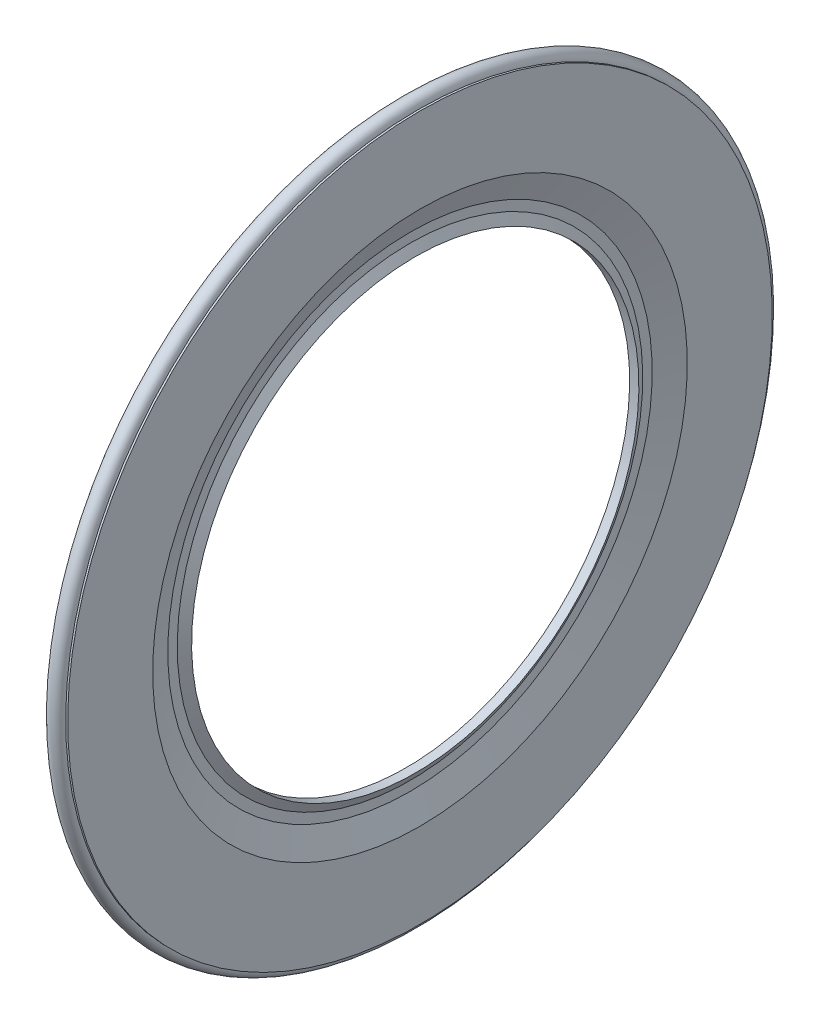
ISO-10303-21;
HEADER;
FILE_DESCRIPTION(('STEP AP214'),'2;1');
FILE_NAME('part.step','',(''),(''),'','','');
FILE_SCHEMA(('AUTOMOTIVE_DESIGN { 1 0 10303 214 1 1 1 1 }'));
ENDSEC;
DATA;
#1=APPLICATION_CONTEXT('core data for automotive mechanical design processes');
#2=APPLICATION_PROTOCOL_DEFINITION('international standard','automotive_design',2000,#1);
#3=PRODUCT_CONTEXT('',#1,'mechanical');
#4=PRODUCT('Part','Part','',(#3));
#5=PRODUCT_RELATED_PRODUCT_CATEGORY('part','',(#4));
#6=PRODUCT_DEFINITION_FORMATION('','',#4);
#7=PRODUCT_DEFINITION_CONTEXT('part definition',#1,'design');
#8=PRODUCT_DEFINITION('design','',#6,#7);
#9=PRODUCT_DEFINITION_SHAPE('','',#8);
#10=(LENGTH_UNIT() NAMED_UNIT(*) SI_UNIT(.MILLI.,.METRE.));
#11=(NAMED_UNIT(*) PLANE_ANGLE_UNIT() SI_UNIT($,.RADIAN.));
#12=(NAMED_UNIT(*) SI_UNIT($,.STERADIAN.) SOLID_ANGLE_UNIT());
#13=UNCERTAINTY_MEASURE_WITH_UNIT(LENGTH_MEASURE(1.E-05),#10,'distance_accuracy_value','');
#14=(GEOMETRIC_REPRESENTATION_CONTEXT(3) GLOBAL_UNCERTAINTY_ASSIGNED_CONTEXT((#13)) GLOBAL_UNIT_ASSIGNED_CONTEXT((#10,
#11,#12)) REPRESENTATION_CONTEXT('',''));
#15=CARTESIAN_POINT('',(0.,0.,0.));
#16=DIRECTION('',(0.,0.,1.));
#17=DIRECTION('',(1.,0.,0.));
#18=AXIS2_PLACEMENT_3D('',#15,#16,#17);
#19=CARTESIAN_POINT('',(11.3336196028279,3.00425879037844,0.));
#20=DIRECTION('',(-1.,0.,0.));
#21=DIRECTION('',(0.,1.,0.));
#22=AXIS2_PLACEMENT_3D('',#19,#20,#21);
#23=PLANE('',#22);
#24=CARTESIAN_POINT('',(11.3336196028279,0.,0.));
#25=DIRECTION('',(-1.,0.,0.));
#26=DIRECTION('',(0.,1.,0.));
#27=AXIS2_PLACEMENT_3D('',#24,#25,#26);
#28=CIRCLE('',#27,3.1228125);
#29=CARTESIAN_POINT('',(11.3336196028279,3.1228125,0.));
#30=VERTEX_POINT('',#29);
#31=EDGE_CURVE('E11',#30,#30,#28,.T.);
#32=ORIENTED_EDGE('',*,*,#31,.T.);
#33=EDGE_LOOP('',(#32));
#34=FACE_BOUND('',#33,.T.);
#35=CARTESIAN_POINT('',(11.3336196028279,0.,0.));
#36=DIRECTION('',(-1.,0.,0.));
#37=DIRECTION('',(0.,1.,0.));
#38=AXIS2_PLACEMENT_3D('',#35,#36,#37);
#39=CIRCLE('',#38,2.88570508075688);
#40=CARTESIAN_POINT('',(11.3336196028279,2.88570508075688,0.));
#41=VERTEX_POINT('',#40);
#42=EDGE_CURVE('E103',#41,#41,#39,.T.);
#43=ORIENTED_EDGE('',*,*,#42,.F.);
#44=EDGE_LOOP('',(#43));
#45=FACE_BOUND('',#44,.T.);
#46=ADVANCED_FACE('F34',(#34,#45),#23,.T.);
#47=CARTESIAN_POINT('',(11.3461196028279,0.,0.));
#48=DIRECTION('',(1.,0.,0.));
#49=DIRECTION('',(0.,1.,0.));
#50=AXIS2_PLACEMENT_3D('',#47,#48,#49);
#51=CONICAL_SURFACE('',#50,3.15421875,1.19200668619344);
#52=CARTESIAN_POINT('',(11.3586196028279,0.,0.));
#53=DIRECTION('',(-1.,0.,0.));
#54=DIRECTION('',(0.,1.,0.));
#55=AXIS2_PLACEMENT_3D('',#52,#53,#54);
#56=CIRCLE('',#55,3.185625);
#57=CARTESIAN_POINT('',(11.3586196028279,3.185625,0.));
#58=VERTEX_POINT('',#57);
#59=EDGE_CURVE('E44',#58,#58,#56,.T.);
#60=ORIENTED_EDGE('',*,*,#59,.T.);
#61=EDGE_LOOP('',(#60));
#62=FACE_BOUND('',#61,.T.);
#63=ORIENTED_EDGE('',*,*,#31,.F.);
#64=EDGE_LOOP('',(#63));
#65=FACE_BOUND('',#64,.T.);
#66=ADVANCED_FACE('F130',(#62,#65),#51,.T.);
#67=CARTESIAN_POINT('',(11.3586196028279,3.5625,0.));
#68=DIRECTION('',(-1.,0.,0.));
#69=DIRECTION('',(0.,1.,0.));
#70=AXIS2_PLACEMENT_3D('',#67,#68,#69);
#71=PLANE('',#70);
#72=CARTESIAN_POINT('',(11.3586196028279,0.,0.));
#73=DIRECTION('',(-1.,0.,0.));
#74=DIRECTION('',(0.,1.,0.));
#75=AXIS2_PLACEMENT_3D('',#72,#73,#74);
#76=CIRCLE('',#75,3.939375);
#77=CARTESIAN_POINT('',(11.3586196028279,3.939375,0.));
#78=VERTEX_POINT('',#77);
#79=EDGE_CURVE('E87',#78,#78,#76,.T.);
#80=ORIENTED_EDGE('',*,*,#79,.T.);
#81=EDGE_LOOP('',(#80));
#82=FACE_BOUND('',#81,.T.);
#83=ORIENTED_EDGE('',*,*,#59,.F.);
#84=EDGE_LOOP('',(#83));
#85=FACE_BOUND('',#84,.T.);
#86=ADVANCED_FACE('F88',(#82,#85),#71,.T.);
#87=CARTESIAN_POINT('',(11.3461196028279,0.,0.));
#88=DIRECTION('',(-1.,0.,0.));
#89=DIRECTION('',(0.,1.,0.));
#90=AXIS2_PLACEMENT_3D('',#87,#88,#89);
#91=CONICAL_SURFACE('',#90,3.97078125,1.19200668619344);
#92=CARTESIAN_POINT('',(11.3336196028279,0.,0.));
#93=DIRECTION('',(-1.,0.,0.));
#94=DIRECTION('',(0.,1.,0.));
#95=AXIS2_PLACEMENT_3D('',#92,#93,#94);
#96=CIRCLE('',#95,4.0021875);
#97=CARTESIAN_POINT('',(11.3336196028279,4.0021875,0.));
#98=VERTEX_POINT('',#97);
#99=EDGE_CURVE('E91',#98,#98,#96,.T.);
#100=ORIENTED_EDGE('',*,*,#99,.T.);
#101=EDGE_LOOP('',(#100));
#102=FACE_BOUND('',#101,.T.);
#103=ORIENTED_EDGE('',*,*,#79,.F.);
#104=EDGE_LOOP('',(#103));
#105=FACE_BOUND('',#104,.T.);
#106=ADVANCED_FACE('F166',(#102,#105),#91,.F.);
#107=CARTESIAN_POINT('',(11.3336196028279,4.20540999327026,0.));
#108=DIRECTION('',(-1.,0.,0.));
#109=DIRECTION('',(0.,1.,0.));
#110=AXIS2_PLACEMENT_3D('',#107,#108,#109);
#111=PLANE('',#110);
#112=CARTESIAN_POINT('',(11.3336196028279,0.,0.));
#113=DIRECTION('',(-1.,0.,0.));
#114=DIRECTION('',(0.,1.,0.));
#115=AXIS2_PLACEMENT_3D('',#112,#113,#114);
#116=CIRCLE('',#115,4.40863248654051);
#117=CARTESIAN_POINT('',(11.3336196028279,4.40863248654051,0.));
#118=VERTEX_POINT('',#117);
#119=EDGE_CURVE('E38',#118,#118,#116,.T.);
#120=ORIENTED_EDGE('',*,*,#119,.T.);
#121=EDGE_LOOP('',(#120));
#122=FACE_BOUND('',#121,.T.);
#123=ORIENTED_EDGE('',*,*,#99,.F.);
#124=EDGE_LOOP('',(#123));
#125=FACE_BOUND('',#124,.T.);
#126=ADVANCED_FACE('F167',(#122,#125),#111,.T.);
#127=CARTESIAN_POINT('',(11.4336196028279,0.,0.));
#128=DIRECTION('',(-1.,0.,0.));
#129=DIRECTION('',(0.,0.,1.));
#130=AXIS2_PLACEMENT_3D('',#127,#128,#129);
#131=TOROIDAL_SURFACE('',#130,4.40863248654051,0.1);
#132=CARTESIAN_POINT('',(11.5336196028279,0.,0.));
#133=DIRECTION('',(-1.,0.,0.));
#134=DIRECTION('',(0.,1.,0.));
#135=AXIS2_PLACEMENT_3D('',#132,#133,#134);
#136=CIRCLE('',#135,4.40863248654051);
#137=CARTESIAN_POINT('',(11.5336196028279,4.40863248654051,0.));
#138=VERTEX_POINT('',#137);
#139=EDGE_CURVE('E104',#138,#138,#136,.T.);
#140=ORIENTED_EDGE('',*,*,#139,.T.);
#141=EDGE_LOOP('',(#140));
#142=FACE_BOUND('',#141,.T.);
#143=ORIENTED_EDGE('',*,*,#119,.F.);
#144=EDGE_LOOP('',(#143));
#145=FACE_BOUND('',#144,.T.);
#146=ADVANCED_FACE('F125',(#142,#145),#131,.T.);
#147=CARTESIAN_POINT('',(11.5461196028279,0.,0.));
#148=DIRECTION('',(1.,0.,0.));
#149=DIRECTION('',(0.,1.,0.));
#150=AXIS2_PLACEMENT_3D('',#147,#148,#149);
#151=CYLINDRICAL_SURFACE('',#150,4.40863248654051);
#152=CARTESIAN_POINT('',(11.5586196028279,0.,0.));
#153=DIRECTION('',(-1.,0.,0.));
#154=DIRECTION('',(0.,1.,0.));
#155=AXIS2_PLACEMENT_3D('',#152,#153,#154);
#156=CIRCLE('',#155,4.40863248654051);
#157=CARTESIAN_POINT('',(11.5586196028279,4.40863248654051,0.));
#158=VERTEX_POINT('',#157);
#159=EDGE_CURVE('E95',#158,#158,#156,.T.);
#160=ORIENTED_EDGE('',*,*,#159,.T.);
#161=EDGE_LOOP('',(#160));
#162=FACE_BOUND('',#161,.T.);
#163=ORIENTED_EDGE('',*,*,#139,.F.);
#164=EDGE_LOOP('',(#163));
#165=FACE_BOUND('',#164,.T.);
#166=ADVANCED_FACE('F111',(#162,#165),#151,.T.);
#167=CARTESIAN_POINT('',(11.5586196028279,3.87687434808104,0.));
#168=DIRECTION('',(1.,0.,0.));
#169=DIRECTION('',(0.,-1.,0.));
#170=AXIS2_PLACEMENT_3D('',#167,#168,#169);
#171=PLANE('',#170);
#172=CARTESIAN_POINT('',(11.5586196028279,0.,0.));
#173=DIRECTION('',(-1.,0.,0.));
#174=DIRECTION('',(0.,1.,0.));
#175=AXIS2_PLACEMENT_3D('',#172,#173,#174);
#176=CIRCLE('',#175,3.34511620962155);
#177=CARTESIAN_POINT('',(11.5586196028279,3.34511620962155,0.));
#178=VERTEX_POINT('',#177);
#179=EDGE_CURVE('E100',#178,#178,#176,.T.);
#180=ORIENTED_EDGE('',*,*,#179,.T.);
#181=EDGE_LOOP('',(#180));
#182=FACE_BOUND('',#181,.T.);
#183=ORIENTED_EDGE('',*,*,#159,.F.);
#184=EDGE_LOOP('',(#183));
#185=FACE_BOUND('',#184,.T.);
#186=ADVANCED_FACE('F114',(#182,#185),#171,.T.);
#187=CARTESIAN_POINT('',(11.4961196028279,0.,0.));
#188=DIRECTION('',(1.,0.,0.));
#189=DIRECTION('',(0.,1.,0.));
#190=AXIS2_PLACEMENT_3D('',#187,#188,#189);
#191=CONICAL_SURFACE('',#190,3.18808495962156,1.19200668619344);
#192=CARTESIAN_POINT('',(11.4336196028279,0.,0.));
#193=DIRECTION('',(-1.,0.,0.));
#194=DIRECTION('',(0.,1.,0.));
#195=AXIS2_PLACEMENT_3D('',#192,#193,#194);
#196=CIRCLE('',#195,3.03105370962156);
#197=CARTESIAN_POINT('',(11.4336196028279,3.03105370962155,0.));
#198=VERTEX_POINT('',#197);
#199=EDGE_CURVE('E68',#198,#198,#196,.T.);
#200=ORIENTED_EDGE('',*,*,#199,.T.);
#201=EDGE_LOOP('',(#200));
#202=FACE_BOUND('',#201,.T.);
#203=ORIENTED_EDGE('',*,*,#179,.F.);
#204=EDGE_LOOP('',(#203));
#205=FACE_BOUND('',#204,.T.);
#206=ADVANCED_FACE('F116',(#202,#205),#191,.F.);
#207=CARTESIAN_POINT('',(11.4336196028279,2.97177685481077,0.));
#208=DIRECTION('',(1.,0.,0.));
#209=DIRECTION('',(0.,-1.,0.));
#210=AXIS2_PLACEMENT_3D('',#207,#208,#209);
#211=PLANE('',#210);
#212=CARTESIAN_POINT('',(11.4336196028279,0.,0.));
#213=DIRECTION('',(-1.,0.,0.));
#214=DIRECTION('',(0.,1.,0.));
#215=AXIS2_PLACEMENT_3D('',#212,#213,#214);
#216=CIRCLE('',#215,2.9125);
#217=CARTESIAN_POINT('',(11.4336196028279,2.9125,0.));
#218=VERTEX_POINT('',#217);
#219=EDGE_CURVE('E75',#218,#218,#216,.T.);
#220=ORIENTED_EDGE('',*,*,#219,.T.);
#221=EDGE_LOOP('',(#220));
#222=FACE_BOUND('',#221,.T.);
#223=ORIENTED_EDGE('',*,*,#199,.F.);
#224=EDGE_LOOP('',(#223));
#225=FACE_BOUND('',#224,.T.);
#226=ADVANCED_FACE('F123',(#222,#225),#211,.T.);
#227=CARTESIAN_POINT('',(11.4664332820648,0.,0.));
#228=DIRECTION('',(-1.,0.,0.));
#229=DIRECTION('',(0.,1.,0.));
#230=AXIS2_PLACEMENT_3D('',#227,#228,#229);
#231=CONICAL_SURFACE('',#230,2.85566504037844,1.0471975511966);
#232=CARTESIAN_POINT('',(11.4992469613017,0.,0.));
#233=DIRECTION('',(-1.,0.,0.));
#234=DIRECTION('',(0.,1.,0.));
#235=AXIS2_PLACEMENT_3D('',#232,#233,#234);
#236=CIRCLE('',#235,2.79883008075688);
#237=CARTESIAN_POINT('',(11.4992469613017,2.79883008075688,0.));
#238=VERTEX_POINT('',#237);
#239=EDGE_CURVE('E99',#238,#238,#236,.T.);
#240=ORIENTED_EDGE('',*,*,#239,.T.);
#241=EDGE_LOOP('',(#240));
#242=FACE_BOUND('',#241,.T.);
#243=ORIENTED_EDGE('',*,*,#219,.F.);
#244=EDGE_LOOP('',(#243));
#245=FACE_BOUND('',#244,.T.);
#246=ADVANCED_FACE('F36',(#242,#245),#231,.T.);
#247=CARTESIAN_POINT('',(11.4415119343827,0.,0.));
#248=DIRECTION('',(1.,0.,0.));
#249=DIRECTION('',(0.,1.,0.));
#250=AXIS2_PLACEMENT_3D('',#247,#248,#249);
#251=CYLINDRICAL_SURFACE('',#250,2.79883008075688);
#252=CARTESIAN_POINT('',(11.3837769074638,0.,0.));
#253=DIRECTION('',(-1.,0.,0.));
#254=DIRECTION('',(0.,1.,0.));
#255=AXIS2_PLACEMENT_3D('',#252,#253,#254);
#256=CIRCLE('',#255,2.79883008075688);
#257=CARTESIAN_POINT('',(11.3837769074638,2.79883008075688,0.));
#258=VERTEX_POINT('',#257);
#259=EDGE_CURVE('E148',#258,#258,#256,.T.);
#260=ORIENTED_EDGE('',*,*,#259,.T.);
#261=EDGE_LOOP('',(#260));
#262=FACE_BOUND('',#261,.T.);
#263=ORIENTED_EDGE('',*,*,#239,.F.);
#264=EDGE_LOOP('',(#263));
#265=FACE_BOUND('',#264,.T.);
#266=ADVANCED_FACE('F139',(#262,#265),#251,.F.);
#267=CARTESIAN_POINT('',(11.3586982551458,0.,0.));
#268=DIRECTION('',(-1.,0.,0.));
#269=DIRECTION('',(0.,1.,0.));
#270=AXIS2_PLACEMENT_3D('',#267,#268,#269);
#271=CONICAL_SURFACE('',#270,2.84226758075689,1.0471975511966);
#272=ORIENTED_EDGE('',*,*,#42,.T.);
#273=EDGE_LOOP('',(#272));
#274=FACE_BOUND('',#273,.T.);
#275=ORIENTED_EDGE('',*,*,#259,.F.);
#276=EDGE_LOOP('',(#275));
#277=FACE_BOUND('',#276,.T.);
#278=ADVANCED_FACE('F137',(#274,#277),#271,.F.);
#279=CLOSED_SHELL('',(#46,#66,#86,#106,#126,#146,#166,#186,#206,#226,#246,#266,#278));
#280=MANIFOLD_SOLID_BREP('B2',#279);
#281=ADVANCED_BREP_SHAPE_REPRESENTATION('',(#18,#280),#14);
#282=SHAPE_DEFINITION_REPRESENTATION(#9,#281);
ENDSEC;
END-ISO-10303-21;
